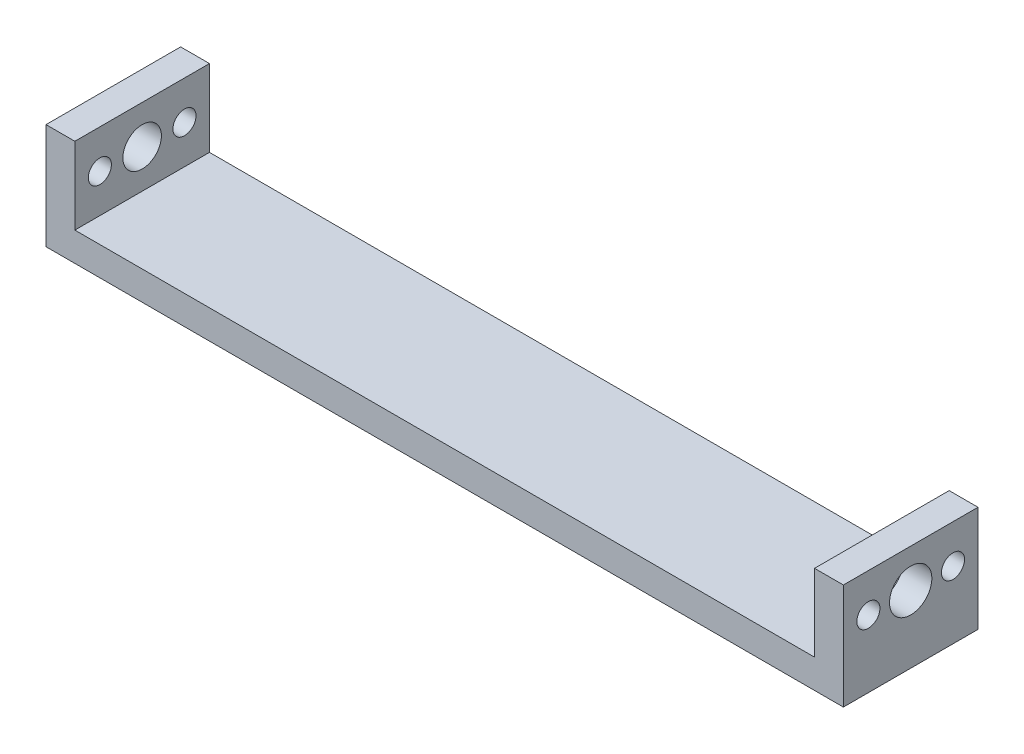
ISO-10303-21;
HEADER;
FILE_DESCRIPTION(('STEP AP214'),'2;1');
FILE_NAME('part.step','',(''),(''),'','','');
FILE_SCHEMA(('AUTOMOTIVE_DESIGN { 1 0 10303 214 1 1 1 1 }'));
ENDSEC;
DATA;
#1=APPLICATION_CONTEXT('core data for automotive mechanical design processes');
#2=APPLICATION_PROTOCOL_DEFINITION('international standard','automotive_design',2000,#1);
#3=PRODUCT_CONTEXT('',#1,'mechanical');
#4=PRODUCT('Part','Part','',(#3));
#5=PRODUCT_RELATED_PRODUCT_CATEGORY('part','',(#4));
#6=PRODUCT_DEFINITION_FORMATION('','',#4);
#7=PRODUCT_DEFINITION_CONTEXT('part definition',#1,'design');
#8=PRODUCT_DEFINITION('design','',#6,#7);
#9=PRODUCT_DEFINITION_SHAPE('','',#8);
#10=(LENGTH_UNIT() NAMED_UNIT(*) SI_UNIT(.MILLI.,.METRE.));
#11=(NAMED_UNIT(*) PLANE_ANGLE_UNIT() SI_UNIT($,.RADIAN.));
#12=(NAMED_UNIT(*) SI_UNIT($,.STERADIAN.) SOLID_ANGLE_UNIT());
#13=UNCERTAINTY_MEASURE_WITH_UNIT(LENGTH_MEASURE(1.E-05),#10,'distance_accuracy_value','');
#14=(GEOMETRIC_REPRESENTATION_CONTEXT(3) GLOBAL_UNCERTAINTY_ASSIGNED_CONTEXT((#13)) GLOBAL_UNIT_ASSIGNED_CONTEXT((#10,
#11,#12)) REPRESENTATION_CONTEXT('',''));
#15=CARTESIAN_POINT('',(0.,0.,0.));
#16=DIRECTION('',(0.,0.,1.));
#17=DIRECTION('',(1.,0.,0.));
#18=AXIS2_PLACEMENT_3D('',#15,#16,#17);
#19=CARTESIAN_POINT('',(-207.952872215709,0.,70.));
#20=DIRECTION('',(-1.,0.,0.));
#21=DIRECTION('',(0.,0.,1.));
#22=AXIS2_PLACEMENT_3D('',#19,#20,#21);
#23=PLANE('',#22);
#24=CARTESIAN_POINT('',(-207.952872215709,20.,57.));
#25=DIRECTION('',(1.,0.,0.));
#26=DIRECTION('',(0.,0.,-1.));
#27=AXIS2_PLACEMENT_3D('',#24,#25,#26);
#28=CIRCLE('',#27,5.99999999999999);
#29=CARTESIAN_POINT('',(-207.952872215709,20.,51.));
#30=VERTEX_POINT('',#29);
#31=EDGE_CURVE('E191',#30,#30,#28,.T.);
#32=ORIENTED_EDGE('',*,*,#31,.F.);
#33=EDGE_LOOP('',(#32));
#34=FACE_BOUND('',#33,.T.);
#35=CARTESIAN_POINT('',(-207.952872215709,20.,13.));
#36=DIRECTION('',(1.,0.,0.));
#37=DIRECTION('',(0.,0.,-1.));
#38=AXIS2_PLACEMENT_3D('',#35,#36,#37);
#39=CIRCLE('',#38,6.);
#40=CARTESIAN_POINT('',(-207.952872215709,20.,7.));
#41=VERTEX_POINT('',#40);
#42=EDGE_CURVE('E185',#41,#41,#39,.T.);
#43=ORIENTED_EDGE('',*,*,#42,.F.);
#44=EDGE_LOOP('',(#43));
#45=FACE_BOUND('',#44,.T.);
#46=CARTESIAN_POINT('',(-207.952872215709,20.,35.));
#47=DIRECTION('',(1.,0.,0.));
#48=DIRECTION('',(0.,0.,-1.));
#49=AXIS2_PLACEMENT_3D('',#46,#47,#48);
#50=CIRCLE('',#49,10.);
#51=CARTESIAN_POINT('',(-207.952872215709,20.,25.));
#52=VERTEX_POINT('',#51);
#53=EDGE_CURVE('E179',#52,#52,#50,.T.);
#54=ORIENTED_EDGE('',*,*,#53,.F.);
#55=EDGE_LOOP('',(#54));
#56=FACE_BOUND('',#55,.T.);
#57=DIRECTION('',(0.,1.,0.));
#58=VECTOR('',#57,1.);
#59=CARTESIAN_POINT('',(-207.952872215709,0.,0.));
#60=LINE('',#59,#58);
#61=CARTESIAN_POINT('',(-207.952872215709,0.,0.));
#62=VERTEX_POINT('',#61);
#63=CARTESIAN_POINT('',(-207.952872215709,40.,0.));
#64=VERTEX_POINT('',#63);
#65=EDGE_CURVE('E129',#62,#64,#60,.T.);
#66=ORIENTED_EDGE('',*,*,#65,.T.);
#67=DIRECTION('',(0.,0.,-1.));
#68=VECTOR('',#67,1.);
#69=CARTESIAN_POINT('',(-207.952872215709,40.,70.));
#70=LINE('',#69,#68);
#71=CARTESIAN_POINT('',(-207.952872215709,40.,70.));
#72=VERTEX_POINT('',#71);
#73=EDGE_CURVE('E11',#72,#64,#70,.T.);
#74=ORIENTED_EDGE('',*,*,#73,.F.);
#75=DIRECTION('',(0.,1.,0.));
#76=VECTOR('',#75,1.);
#77=CARTESIAN_POINT('',(-207.952872215709,0.,70.));
#78=LINE('',#77,#76);
#79=CARTESIAN_POINT('',(-207.952872215709,0.,70.));
#80=VERTEX_POINT('',#79);
#81=EDGE_CURVE('E146',#80,#72,#78,.T.);
#82=ORIENTED_EDGE('',*,*,#81,.F.);
#83=DIRECTION('',(0.,0.,-1.));
#84=VECTOR('',#83,1.);
#85=CARTESIAN_POINT('',(-207.952872215709,0.,70.));
#86=LINE('',#85,#84);
#87=EDGE_CURVE('E125',#80,#62,#86,.T.);
#88=ORIENTED_EDGE('',*,*,#87,.T.);
#89=EDGE_LOOP('',(#66,#74,#82,#88));
#90=FACE_BOUND('',#89,.T.);
#91=ADVANCED_FACE('F33',(#34,#45,#56,#90),#23,.F.);
#92=CARTESIAN_POINT('',(-207.952872215709,40.,70.));
#93=DIRECTION('',(0.,-1.,0.));
#94=DIRECTION('',(1.,0.,0.));
#95=AXIS2_PLACEMENT_3D('',#92,#93,#94);
#96=PLANE('',#95);
#97=DIRECTION('',(-1.,0.,0.));
#98=VECTOR('',#97,1.);
#99=CARTESIAN_POINT('',(-207.952872215709,40.,0.));
#100=LINE('',#99,#98);
#101=CARTESIAN_POINT('',(-222.952872215709,40.,0.));
#102=VERTEX_POINT('',#101);
#103=EDGE_CURVE('E132',#64,#102,#100,.T.);
#104=ORIENTED_EDGE('',*,*,#103,.T.);
#105=DIRECTION('',(0.,0.,-1.));
#106=VECTOR('',#105,1.);
#107=CARTESIAN_POINT('',(-222.952872215709,40.,70.));
#108=LINE('',#107,#106);
#109=CARTESIAN_POINT('',(-222.952872215709,40.,70.));
#110=VERTEX_POINT('',#109);
#111=EDGE_CURVE('E41',#110,#102,#108,.T.);
#112=ORIENTED_EDGE('',*,*,#111,.F.);
#113=DIRECTION('',(-1.,0.,0.));
#114=VECTOR('',#113,1.);
#115=CARTESIAN_POINT('',(-207.952872215709,40.,70.));
#116=LINE('',#115,#114);
#117=EDGE_CURVE('E92',#72,#110,#116,.T.);
#118=ORIENTED_EDGE('',*,*,#117,.F.);
#119=ORIENTED_EDGE('',*,*,#73,.T.);
#120=EDGE_LOOP('',(#104,#112,#118,#119));
#121=FACE_BOUND('',#120,.T.);
#122=ADVANCED_FACE('F161',(#121),#96,.F.);
#123=CARTESIAN_POINT('',(-222.952872215709,0.,70.));
#124=DIRECTION('',(1.,0.,0.));
#125=DIRECTION('',(0.,0.,-1.));
#126=AXIS2_PLACEMENT_3D('',#123,#124,#125);
#127=PLANE('',#126);
#128=CARTESIAN_POINT('',(-222.952872215709,20.,57.));
#129=DIRECTION('',(1.,0.,0.));
#130=DIRECTION('',(0.,0.,-1.));
#131=AXIS2_PLACEMENT_3D('',#128,#129,#130);
#132=CIRCLE('',#131,5.99999999999999);
#133=CARTESIAN_POINT('',(-222.952872215709,20.,51.));
#134=VERTEX_POINT('',#133);
#135=EDGE_CURVE('E188',#134,#134,#132,.T.);
#136=ORIENTED_EDGE('',*,*,#135,.T.);
#137=EDGE_LOOP('',(#136));
#138=FACE_BOUND('',#137,.T.);
#139=CARTESIAN_POINT('',(-222.952872215709,20.,13.));
#140=DIRECTION('',(1.,0.,0.));
#141=DIRECTION('',(0.,0.,-1.));
#142=AXIS2_PLACEMENT_3D('',#139,#140,#141);
#143=CIRCLE('',#142,6.);
#144=CARTESIAN_POINT('',(-222.952872215709,20.,7.));
#145=VERTEX_POINT('',#144);
#146=EDGE_CURVE('E182',#145,#145,#143,.T.);
#147=ORIENTED_EDGE('',*,*,#146,.T.);
#148=EDGE_LOOP('',(#147));
#149=FACE_BOUND('',#148,.T.);
#150=CARTESIAN_POINT('',(-222.952872215709,20.,35.));
#151=DIRECTION('',(1.,0.,0.));
#152=DIRECTION('',(0.,0.,-1.));
#153=AXIS2_PLACEMENT_3D('',#150,#151,#152);
#154=CIRCLE('',#153,10.);
#155=CARTESIAN_POINT('',(-222.952872215709,20.,25.));
#156=VERTEX_POINT('',#155);
#157=EDGE_CURVE('E133',#156,#156,#154,.T.);
#158=ORIENTED_EDGE('',*,*,#157,.T.);
#159=EDGE_LOOP('',(#158));
#160=FACE_BOUND('',#159,.T.);
#161=DIRECTION('',(0.,-1.,0.));
#162=VECTOR('',#161,1.);
#163=CARTESIAN_POINT('',(-222.952872215709,0.,0.));
#164=LINE('',#163,#162);
#165=CARTESIAN_POINT('',(-222.952872215709,-15.,0.));
#166=VERTEX_POINT('',#165);
#167=EDGE_CURVE('E136',#102,#166,#164,.T.);
#168=ORIENTED_EDGE('',*,*,#167,.T.);
#169=DIRECTION('',(0.,0.,-1.));
#170=VECTOR('',#169,1.);
#171=CARTESIAN_POINT('',(-222.952872215709,-15.,70.));
#172=LINE('',#171,#170);
#173=CARTESIAN_POINT('',(-222.952872215709,-15.,70.));
#174=VERTEX_POINT('',#173);
#175=EDGE_CURVE('E153',#174,#166,#172,.T.);
#176=ORIENTED_EDGE('',*,*,#175,.F.);
#177=DIRECTION('',(0.,-1.,0.));
#178=VECTOR('',#177,1.);
#179=CARTESIAN_POINT('',(-222.952872215709,40.,70.));
#180=LINE('',#179,#178);
#181=EDGE_CURVE('E160',#110,#174,#180,.T.);
#182=ORIENTED_EDGE('',*,*,#181,.F.);
#183=ORIENTED_EDGE('',*,*,#111,.T.);
#184=EDGE_LOOP('',(#168,#176,#182,#183));
#185=FACE_BOUND('',#184,.T.);
#186=ADVANCED_FACE('F158',(#138,#149,#160,#185),#127,.F.);
#187=CARTESIAN_POINT('',(-222.952872215709,-15.,70.));
#188=DIRECTION('',(0.,1.,0.));
#189=DIRECTION('',(-1.,0.,0.));
#190=AXIS2_PLACEMENT_3D('',#187,#188,#189);
#191=PLANE('',#190);
#192=DIRECTION('',(1.,0.,0.));
#193=VECTOR('',#192,1.);
#194=CARTESIAN_POINT('',(-222.952872215709,-15.,0.));
#195=LINE('',#194,#193);
#196=CARTESIAN_POINT('',(191.647127784291,-15.,0.));
#197=VERTEX_POINT('',#196);
#198=EDGE_CURVE('E138',#166,#197,#195,.T.);
#199=ORIENTED_EDGE('',*,*,#198,.T.);
#200=DIRECTION('',(0.,0.,-1.));
#201=VECTOR('',#200,1.);
#202=CARTESIAN_POINT('',(191.647127784291,-15.,70.));
#203=LINE('',#202,#201);
#204=CARTESIAN_POINT('',(191.647127784291,-15.,70.));
#205=VERTEX_POINT('',#204);
#206=EDGE_CURVE('E150',#205,#197,#203,.T.);
#207=ORIENTED_EDGE('',*,*,#206,.F.);
#208=DIRECTION('',(1.,0.,0.));
#209=VECTOR('',#208,1.);
#210=CARTESIAN_POINT('',(-222.952872215709,-15.,70.));
#211=LINE('',#210,#209);
#212=EDGE_CURVE('E173',#174,#205,#211,.T.);
#213=ORIENTED_EDGE('',*,*,#212,.F.);
#214=ORIENTED_EDGE('',*,*,#175,.T.);
#215=EDGE_LOOP('',(#199,#207,#213,#214));
#216=FACE_BOUND('',#215,.T.);
#217=ADVANCED_FACE('F169',(#216),#191,.F.);
#218=CARTESIAN_POINT('',(191.647127784291,0.,70.));
#219=DIRECTION('',(-1.,0.,0.));
#220=DIRECTION('',(0.,0.,1.));
#221=AXIS2_PLACEMENT_3D('',#218,#219,#220);
#222=PLANE('',#221);
#223=CARTESIAN_POINT('',(191.647127784291,20.,13.));
#224=DIRECTION('',(-1.,0.,0.));
#225=DIRECTION('',(0.,0.,1.));
#226=AXIS2_PLACEMENT_3D('',#223,#224,#225);
#227=CIRCLE('',#226,6.);
#228=CARTESIAN_POINT('',(191.647127784291,20.,19.));
#229=VERTEX_POINT('',#228);
#230=EDGE_CURVE('E206',#229,#229,#227,.T.);
#231=ORIENTED_EDGE('',*,*,#230,.T.);
#232=EDGE_LOOP('',(#231));
#233=FACE_BOUND('',#232,.T.);
#234=CARTESIAN_POINT('',(191.647127784291,20.,57.));
#235=DIRECTION('',(-1.,0.,0.));
#236=DIRECTION('',(0.,0.,1.));
#237=AXIS2_PLACEMENT_3D('',#234,#235,#236);
#238=CIRCLE('',#237,6.);
#239=CARTESIAN_POINT('',(191.647127784291,20.,63.));
#240=VERTEX_POINT('',#239);
#241=EDGE_CURVE('E200',#240,#240,#238,.T.);
#242=ORIENTED_EDGE('',*,*,#241,.T.);
#243=EDGE_LOOP('',(#242));
#244=FACE_BOUND('',#243,.T.);
#245=CARTESIAN_POINT('',(191.647127784291,20.,35.));
#246=DIRECTION('',(-1.,0.,0.));
#247=DIRECTION('',(0.,0.,1.));
#248=AXIS2_PLACEMENT_3D('',#245,#246,#247);
#249=CIRCLE('',#248,11.);
#250=CARTESIAN_POINT('',(191.647127784291,20.,46.));
#251=VERTEX_POINT('',#250);
#252=EDGE_CURVE('E194',#251,#251,#249,.T.);
#253=ORIENTED_EDGE('',*,*,#252,.T.);
#254=EDGE_LOOP('',(#253));
#255=FACE_BOUND('',#254,.T.);
#256=DIRECTION('',(0.,1.,0.));
#257=VECTOR('',#256,1.);
#258=CARTESIAN_POINT('',(191.647127784291,0.,0.));
#259=LINE('',#258,#257);
#260=CARTESIAN_POINT('',(191.647127784291,40.,0.));
#261=VERTEX_POINT('',#260);
#262=EDGE_CURVE('E141',#197,#261,#259,.T.);
#263=ORIENTED_EDGE('',*,*,#262,.T.);
#264=DIRECTION('',(0.,0.,-1.));
#265=VECTOR('',#264,1.);
#266=CARTESIAN_POINT('',(191.647127784291,40.,70.));
#267=LINE('',#266,#265);
#268=CARTESIAN_POINT('',(191.647127784291,40.,70.));
#269=VERTEX_POINT('',#268);
#270=EDGE_CURVE('E120',#269,#261,#267,.T.);
#271=ORIENTED_EDGE('',*,*,#270,.F.);
#272=DIRECTION('',(0.,1.,0.));
#273=VECTOR('',#272,1.);
#274=CARTESIAN_POINT('',(191.647127784291,-15.,70.));
#275=LINE('',#274,#273);
#276=EDGE_CURVE('E111',#205,#269,#275,.T.);
#277=ORIENTED_EDGE('',*,*,#276,.F.);
#278=ORIENTED_EDGE('',*,*,#206,.T.);
#279=EDGE_LOOP('',(#263,#271,#277,#278));
#280=FACE_BOUND('',#279,.T.);
#281=ADVANCED_FACE('F172',(#233,#244,#255,#280),#222,.F.);
#282=CARTESIAN_POINT('',(191.647127784291,40.,70.));
#283=DIRECTION('',(0.,-1.,0.));
#284=DIRECTION('',(1.,0.,0.));
#285=AXIS2_PLACEMENT_3D('',#282,#283,#284);
#286=PLANE('',#285);
#287=DIRECTION('',(-1.,0.,0.));
#288=VECTOR('',#287,1.);
#289=CARTESIAN_POINT('',(191.647127784291,40.,0.));
#290=LINE('',#289,#288);
#291=CARTESIAN_POINT('',(176.647127784291,40.,0.));
#292=VERTEX_POINT('',#291);
#293=EDGE_CURVE('E119',#261,#292,#290,.T.);
#294=ORIENTED_EDGE('',*,*,#293,.T.);
#295=DIRECTION('',(0.,0.,-1.));
#296=VECTOR('',#295,1.);
#297=CARTESIAN_POINT('',(176.647127784291,40.,70.));
#298=LINE('',#297,#296);
#299=CARTESIAN_POINT('',(176.647127784291,40.,70.));
#300=VERTEX_POINT('',#299);
#301=EDGE_CURVE('E116',#300,#292,#298,.T.);
#302=ORIENTED_EDGE('',*,*,#301,.F.);
#303=DIRECTION('',(-1.,0.,0.));
#304=VECTOR('',#303,1.);
#305=CARTESIAN_POINT('',(191.647127784291,40.,70.));
#306=LINE('',#305,#304);
#307=EDGE_CURVE('E105',#269,#300,#306,.T.);
#308=ORIENTED_EDGE('',*,*,#307,.F.);
#309=ORIENTED_EDGE('',*,*,#270,.T.);
#310=EDGE_LOOP('',(#294,#302,#308,#309));
#311=FACE_BOUND('',#310,.T.);
#312=ADVANCED_FACE('F117',(#311),#286,.F.);
#313=CARTESIAN_POINT('',(176.647127784291,0.,70.));
#314=DIRECTION('',(1.,0.,0.));
#315=DIRECTION('',(0.,0.,-1.));
#316=AXIS2_PLACEMENT_3D('',#313,#314,#315);
#317=PLANE('',#316);
#318=CARTESIAN_POINT('',(176.647127784291,20.,13.));
#319=DIRECTION('',(-1.,0.,0.));
#320=DIRECTION('',(0.,0.,1.));
#321=AXIS2_PLACEMENT_3D('',#318,#319,#320);
#322=CIRCLE('',#321,6.);
#323=CARTESIAN_POINT('',(176.647127784291,20.,19.));
#324=VERTEX_POINT('',#323);
#325=EDGE_CURVE('E209',#324,#324,#322,.T.);
#326=ORIENTED_EDGE('',*,*,#325,.F.);
#327=EDGE_LOOP('',(#326));
#328=FACE_BOUND('',#327,.T.);
#329=CARTESIAN_POINT('',(176.647127784291,20.,57.));
#330=DIRECTION('',(-1.,0.,0.));
#331=DIRECTION('',(0.,0.,1.));
#332=AXIS2_PLACEMENT_3D('',#329,#330,#331);
#333=CIRCLE('',#332,6.);
#334=CARTESIAN_POINT('',(176.647127784291,20.,63.));
#335=VERTEX_POINT('',#334);
#336=EDGE_CURVE('E203',#335,#335,#333,.T.);
#337=ORIENTED_EDGE('',*,*,#336,.F.);
#338=EDGE_LOOP('',(#337));
#339=FACE_BOUND('',#338,.T.);
#340=CARTESIAN_POINT('',(176.647127784291,20.,35.));
#341=DIRECTION('',(-1.,0.,0.));
#342=DIRECTION('',(0.,0.,1.));
#343=AXIS2_PLACEMENT_3D('',#340,#341,#342);
#344=CIRCLE('',#343,11.);
#345=CARTESIAN_POINT('',(176.647127784291,20.,46.));
#346=VERTEX_POINT('',#345);
#347=EDGE_CURVE('E197',#346,#346,#344,.T.);
#348=ORIENTED_EDGE('',*,*,#347,.F.);
#349=EDGE_LOOP('',(#348));
#350=FACE_BOUND('',#349,.T.);
#351=DIRECTION('',(0.,-1.,0.));
#352=VECTOR('',#351,1.);
#353=CARTESIAN_POINT('',(176.647127784291,0.,0.));
#354=LINE('',#353,#352);
#355=CARTESIAN_POINT('',(176.647127784291,0.,0.));
#356=VERTEX_POINT('',#355);
#357=EDGE_CURVE('E78',#292,#356,#354,.T.);
#358=ORIENTED_EDGE('',*,*,#357,.T.);
#359=DIRECTION('',(0.,0.,-1.));
#360=VECTOR('',#359,1.);
#361=CARTESIAN_POINT('',(176.647127784291,0.,70.));
#362=LINE('',#361,#360);
#363=CARTESIAN_POINT('',(176.647127784291,0.,70.));
#364=VERTEX_POINT('',#363);
#365=EDGE_CURVE('E121',#364,#356,#362,.T.);
#366=ORIENTED_EDGE('',*,*,#365,.F.);
#367=DIRECTION('',(0.,-1.,0.));
#368=VECTOR('',#367,1.);
#369=CARTESIAN_POINT('',(176.647127784291,0.,70.));
#370=LINE('',#369,#368);
#371=EDGE_CURVE('E109',#300,#364,#370,.T.);
#372=ORIENTED_EDGE('',*,*,#371,.F.);
#373=ORIENTED_EDGE('',*,*,#301,.T.);
#374=EDGE_LOOP('',(#358,#366,#372,#373));
#375=FACE_BOUND('',#374,.T.);
#376=ADVANCED_FACE('F123',(#328,#339,#350,#375),#317,.F.);
#377=CARTESIAN_POINT('',(-207.952872215709,0.,70.));
#378=DIRECTION('',(0.,-1.,0.));
#379=DIRECTION('',(0.,0.,-1.));
#380=AXIS2_PLACEMENT_3D('',#377,#378,#379);
#381=PLANE('',#380);
#382=DIRECTION('',(-1.,0.,0.));
#383=VECTOR('',#382,1.);
#384=CARTESIAN_POINT('',(-207.952872215709,0.,0.));
#385=LINE('',#384,#383);
#386=EDGE_CURVE('E84',#356,#62,#385,.T.);
#387=ORIENTED_EDGE('',*,*,#386,.T.);
#388=ORIENTED_EDGE('',*,*,#87,.F.);
#389=DIRECTION('',(-1.,0.,0.));
#390=VECTOR('',#389,1.);
#391=CARTESIAN_POINT('',(-207.952872215709,0.,70.));
#392=LINE('',#391,#390);
#393=EDGE_CURVE('E49',#364,#80,#392,.T.);
#394=ORIENTED_EDGE('',*,*,#393,.F.);
#395=ORIENTED_EDGE('',*,*,#365,.T.);
#396=EDGE_LOOP('',(#387,#388,#394,#395));
#397=FACE_BOUND('',#396,.T.);
#398=ADVANCED_FACE('F226',(#397),#381,.F.);
#399=CARTESIAN_POINT('',(0.,0.,70.));
#400=DIRECTION('',(0.,0.,1.));
#401=DIRECTION('',(1.,0.,0.));
#402=AXIS2_PLACEMENT_3D('',#399,#400,#401);
#403=PLANE('',#402);
#404=ORIENTED_EDGE('',*,*,#81,.T.);
#405=ORIENTED_EDGE('',*,*,#117,.T.);
#406=ORIENTED_EDGE('',*,*,#181,.T.);
#407=ORIENTED_EDGE('',*,*,#212,.T.);
#408=ORIENTED_EDGE('',*,*,#276,.T.);
#409=ORIENTED_EDGE('',*,*,#307,.T.);
#410=ORIENTED_EDGE('',*,*,#371,.T.);
#411=ORIENTED_EDGE('',*,*,#393,.T.);
#412=EDGE_LOOP('',(#404,#405,#406,#407,#408,#409,#410,#411));
#413=FACE_BOUND('',#412,.T.);
#414=ADVANCED_FACE('F107',(#413),#403,.T.);
#415=CARTESIAN_POINT('',(0.,0.,0.));
#416=DIRECTION('',(0.,0.,1.));
#417=DIRECTION('',(1.,0.,0.));
#418=AXIS2_PLACEMENT_3D('',#415,#416,#417);
#419=PLANE('',#418);
#420=ORIENTED_EDGE('',*,*,#65,.F.);
#421=ORIENTED_EDGE('',*,*,#386,.F.);
#422=ORIENTED_EDGE('',*,*,#357,.F.);
#423=ORIENTED_EDGE('',*,*,#293,.F.);
#424=ORIENTED_EDGE('',*,*,#262,.F.);
#425=ORIENTED_EDGE('',*,*,#198,.F.);
#426=ORIENTED_EDGE('',*,*,#167,.F.);
#427=ORIENTED_EDGE('',*,*,#103,.F.);
#428=EDGE_LOOP('',(#420,#421,#422,#423,#424,#425,#426,#427));
#429=FACE_BOUND('',#428,.T.);
#430=ADVANCED_FACE('F165',(#429),#419,.F.);
#431=CARTESIAN_POINT('',(-222.952872215709,20.,35.));
#432=DIRECTION('',(1.,0.,0.));
#433=DIRECTION('',(0.,0.,-1.));
#434=AXIS2_PLACEMENT_3D('',#431,#432,#433);
#435=CYLINDRICAL_SURFACE('',#434,10.);
#436=ORIENTED_EDGE('',*,*,#157,.F.);
#437=EDGE_LOOP('',(#436));
#438=FACE_BOUND('',#437,.T.);
#439=ORIENTED_EDGE('',*,*,#53,.T.);
#440=EDGE_LOOP('',(#439));
#441=FACE_BOUND('',#440,.T.);
#442=ADVANCED_FACE('F283',(#438,#441),#435,.F.);
#443=CARTESIAN_POINT('',(-222.952872215709,20.,13.));
#444=DIRECTION('',(1.,0.,0.));
#445=DIRECTION('',(0.,0.,-1.));
#446=AXIS2_PLACEMENT_3D('',#443,#444,#445);
#447=CYLINDRICAL_SURFACE('',#446,6.);
#448=ORIENTED_EDGE('',*,*,#146,.F.);
#449=EDGE_LOOP('',(#448));
#450=FACE_BOUND('',#449,.T.);
#451=ORIENTED_EDGE('',*,*,#42,.T.);
#452=EDGE_LOOP('',(#451));
#453=FACE_BOUND('',#452,.T.);
#454=ADVANCED_FACE('F243',(#450,#453),#447,.F.);
#455=CARTESIAN_POINT('',(-222.952872215709,20.,57.));
#456=DIRECTION('',(1.,0.,0.));
#457=DIRECTION('',(0.,0.,-1.));
#458=AXIS2_PLACEMENT_3D('',#455,#456,#457);
#459=CYLINDRICAL_SURFACE('',#458,5.99999999999999);
#460=ORIENTED_EDGE('',*,*,#135,.F.);
#461=EDGE_LOOP('',(#460));
#462=FACE_BOUND('',#461,.T.);
#463=ORIENTED_EDGE('',*,*,#31,.T.);
#464=EDGE_LOOP('',(#463));
#465=FACE_BOUND('',#464,.T.);
#466=ADVANCED_FACE('F234',(#462,#465),#459,.F.);
#467=CARTESIAN_POINT('',(191.647127784291,20.,35.));
#468=DIRECTION('',(-1.,0.,0.));
#469=DIRECTION('',(0.,0.,1.));
#470=AXIS2_PLACEMENT_3D('',#467,#468,#469);
#471=CYLINDRICAL_SURFACE('',#470,11.);
#472=ORIENTED_EDGE('',*,*,#252,.F.);
#473=EDGE_LOOP('',(#472));
#474=FACE_BOUND('',#473,.T.);
#475=ORIENTED_EDGE('',*,*,#347,.T.);
#476=EDGE_LOOP('',(#475));
#477=FACE_BOUND('',#476,.T.);
#478=ADVANCED_FACE('F232',(#474,#477),#471,.F.);
#479=CARTESIAN_POINT('',(191.647127784291,20.,57.));
#480=DIRECTION('',(-1.,0.,0.));
#481=DIRECTION('',(0.,0.,1.));
#482=AXIS2_PLACEMENT_3D('',#479,#480,#481);
#483=CYLINDRICAL_SURFACE('',#482,6.);
#484=ORIENTED_EDGE('',*,*,#241,.F.);
#485=EDGE_LOOP('',(#484));
#486=FACE_BOUND('',#485,.T.);
#487=ORIENTED_EDGE('',*,*,#336,.T.);
#488=EDGE_LOOP('',(#487));
#489=FACE_BOUND('',#488,.T.);
#490=ADVANCED_FACE('F220',(#486,#489),#483,.F.);
#491=CARTESIAN_POINT('',(191.647127784291,20.,13.));
#492=DIRECTION('',(-1.,0.,0.));
#493=DIRECTION('',(0.,0.,1.));
#494=AXIS2_PLACEMENT_3D('',#491,#492,#493);
#495=CYLINDRICAL_SURFACE('',#494,6.);
#496=ORIENTED_EDGE('',*,*,#230,.F.);
#497=EDGE_LOOP('',(#496));
#498=FACE_BOUND('',#497,.T.);
#499=ORIENTED_EDGE('',*,*,#325,.T.);
#500=EDGE_LOOP('',(#499));
#501=FACE_BOUND('',#500,.T.);
#502=ADVANCED_FACE('F217',(#498,#501),#495,.F.);
#503=CLOSED_SHELL('',(#91,#122,#186,#217,#281,#312,#376,#398,#414,#430,#442,#454,#466,#478,#490,#502));
#504=MANIFOLD_SOLID_BREP('B2',#503);
#505=ADVANCED_BREP_SHAPE_REPRESENTATION('',(#18,#504),#14);
#506=SHAPE_DEFINITION_REPRESENTATION(#9,#505);
ENDSEC;
END-ISO-10303-21;
